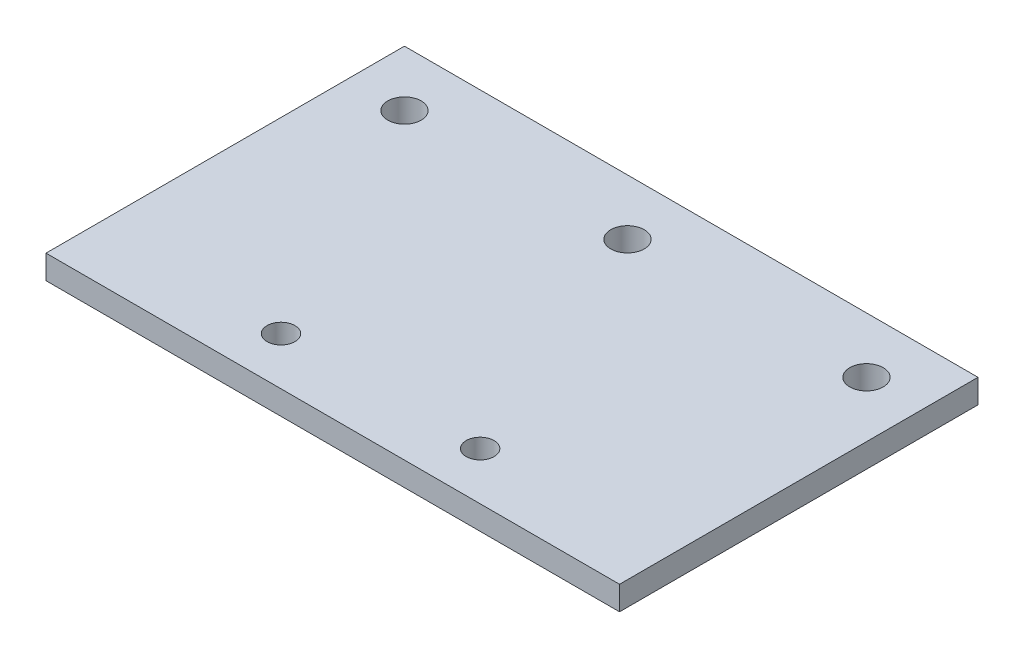
ISO-10303-21;
HEADER;
FILE_DESCRIPTION(('STEP AP214'),'2;1');
FILE_NAME('part.step','',(''),(''),'','','');
FILE_SCHEMA(('AUTOMOTIVE_DESIGN { 1 0 10303 214 1 1 1 1 }'));
ENDSEC;
DATA;
#1=APPLICATION_CONTEXT('core data for automotive mechanical design processes');
#2=APPLICATION_PROTOCOL_DEFINITION('international standard','automotive_design',2000,#1);
#3=PRODUCT_CONTEXT('',#1,'mechanical');
#4=PRODUCT('Part','Part','',(#3));
#5=PRODUCT_RELATED_PRODUCT_CATEGORY('part','',(#4));
#6=PRODUCT_DEFINITION_FORMATION('','',#4);
#7=PRODUCT_DEFINITION_CONTEXT('part definition',#1,'design');
#8=PRODUCT_DEFINITION('design','',#6,#7);
#9=PRODUCT_DEFINITION_SHAPE('','',#8);
#10=(LENGTH_UNIT() NAMED_UNIT(*) SI_UNIT(.MILLI.,.METRE.));
#11=(NAMED_UNIT(*) PLANE_ANGLE_UNIT() SI_UNIT($,.RADIAN.));
#12=(NAMED_UNIT(*) SI_UNIT($,.STERADIAN.) SOLID_ANGLE_UNIT());
#13=UNCERTAINTY_MEASURE_WITH_UNIT(LENGTH_MEASURE(1.E-05),#10,'distance_accuracy_value','');
#14=(GEOMETRIC_REPRESENTATION_CONTEXT(3) GLOBAL_UNCERTAINTY_ASSIGNED_CONTEXT((#13)) GLOBAL_UNIT_ASSIGNED_CONTEXT((#10,
#11,#12)) REPRESENTATION_CONTEXT('',''));
#15=CARTESIAN_POINT('',(0.,0.,0.));
#16=DIRECTION('',(0.,0.,1.));
#17=DIRECTION('',(1.,0.,0.));
#18=AXIS2_PLACEMENT_3D('',#15,#16,#17);
#19=CARTESIAN_POINT('',(0.,3.,0.));
#20=DIRECTION('',(0.,-1.,0.));
#21=DIRECTION('',(0.,0.,-1.));
#22=AXIS2_PLACEMENT_3D('',#19,#20,#21);
#23=PLANE('',#22);
#24=DIRECTION('',(0.,0.,1.));
#25=VECTOR('',#24,1.);
#26=CARTESIAN_POINT('',(0.,3.,45.));
#27=LINE('',#26,#25);
#28=CARTESIAN_POINT('',(0.,3.,0.));
#29=VERTEX_POINT('',#28);
#30=CARTESIAN_POINT('',(0.,3.,45.));
#31=VERTEX_POINT('',#30);
#32=EDGE_CURVE('E85',#29,#31,#27,.T.);
#33=ORIENTED_EDGE('',*,*,#32,.T.);
#34=DIRECTION('',(1.,0.,0.));
#35=VECTOR('',#34,1.);
#36=CARTESIAN_POINT('',(72.,3.,45.));
#37=LINE('',#36,#35);
#38=CARTESIAN_POINT('',(72.,3.,45.));
#39=VERTEX_POINT('',#38);
#40=EDGE_CURVE('E80',#31,#39,#37,.T.);
#41=ORIENTED_EDGE('',*,*,#40,.T.);
#42=DIRECTION('',(0.,0.,-1.));
#43=VECTOR('',#42,1.);
#44=CARTESIAN_POINT('',(72.,3.,0.));
#45=LINE('',#44,#43);
#46=CARTESIAN_POINT('',(72.,3.,0.));
#47=VERTEX_POINT('',#46);
#48=EDGE_CURVE('E83',#39,#47,#45,.T.);
#49=ORIENTED_EDGE('',*,*,#48,.T.);
#50=DIRECTION('',(-1.,0.,0.));
#51=VECTOR('',#50,1.);
#52=CARTESIAN_POINT('',(0.,3.,0.));
#53=LINE('',#52,#51);
#54=EDGE_CURVE('E50',#47,#29,#53,.T.);
#55=ORIENTED_EDGE('',*,*,#54,.T.);
#56=EDGE_LOOP('',(#33,#41,#49,#55));
#57=FACE_BOUND('',#56,.T.);
#58=CARTESIAN_POINT('',(7.,3.,7.));
#59=DIRECTION('',(0.,1.,0.));
#60=DIRECTION('',(0.,0.,1.));
#61=AXIS2_PLACEMENT_3D('',#58,#59,#60);
#62=CIRCLE('',#61,2.1);
#63=CARTESIAN_POINT('',(7.,3.,9.1));
#64=VERTEX_POINT('',#63);
#65=EDGE_CURVE('E100',#64,#64,#62,.T.);
#66=ORIENTED_EDGE('',*,*,#65,.F.);
#67=EDGE_LOOP('',(#66));
#68=FACE_BOUND('',#67,.T.);
#69=CARTESIAN_POINT('',(35.,3.,7.));
#70=DIRECTION('',(0.,1.,0.));
#71=DIRECTION('',(0.,0.,1.));
#72=AXIS2_PLACEMENT_3D('',#69,#70,#71);
#73=CIRCLE('',#72,2.1);
#74=CARTESIAN_POINT('',(35.,3.,9.1));
#75=VERTEX_POINT('',#74);
#76=EDGE_CURVE('E115',#75,#75,#73,.T.);
#77=ORIENTED_EDGE('',*,*,#76,.F.);
#78=EDGE_LOOP('',(#77));
#79=FACE_BOUND('',#78,.T.);
#80=CARTESIAN_POINT('',(65.,3.,7.));
#81=DIRECTION('',(0.,1.,0.));
#82=DIRECTION('',(0.,0.,1.));
#83=AXIS2_PLACEMENT_3D('',#80,#81,#82);
#84=CIRCLE('',#83,2.1);
#85=CARTESIAN_POINT('',(65.,3.,9.1));
#86=VERTEX_POINT('',#85);
#87=EDGE_CURVE('E121',#86,#86,#84,.T.);
#88=ORIENTED_EDGE('',*,*,#87,.F.);
#89=EDGE_LOOP('',(#88));
#90=FACE_BOUND('',#89,.T.);
#91=CARTESIAN_POINT('',(23.5,3.,39.));
#92=DIRECTION('',(0.,1.,0.));
#93=DIRECTION('',(0.,0.,1.));
#94=AXIS2_PLACEMENT_3D('',#91,#92,#93);
#95=CIRCLE('',#94,1.75);
#96=CARTESIAN_POINT('',(23.5,3.,40.75));
#97=VERTEX_POINT('',#96);
#98=EDGE_CURVE('E127',#97,#97,#95,.T.);
#99=ORIENTED_EDGE('',*,*,#98,.F.);
#100=EDGE_LOOP('',(#99));
#101=FACE_BOUND('',#100,.T.);
#102=CARTESIAN_POINT('',(48.5,3.,39.));
#103=DIRECTION('',(0.,1.,0.));
#104=DIRECTION('',(0.,0.,1.));
#105=AXIS2_PLACEMENT_3D('',#102,#103,#104);
#106=CIRCLE('',#105,1.75);
#107=CARTESIAN_POINT('',(48.5,3.,40.75));
#108=VERTEX_POINT('',#107);
#109=EDGE_CURVE('E133',#108,#108,#106,.T.);
#110=ORIENTED_EDGE('',*,*,#109,.F.);
#111=EDGE_LOOP('',(#110));
#112=FACE_BOUND('',#111,.T.);
#113=ADVANCED_FACE('F33',(#57,#68,#79,#90,#101,#112),#23,.F.);
#114=CARTESIAN_POINT('',(0.,0.,0.));
#115=DIRECTION('',(0.,-1.,0.));
#116=DIRECTION('',(0.,0.,-1.));
#117=AXIS2_PLACEMENT_3D('',#114,#115,#116);
#118=PLANE('',#117);
#119=CARTESIAN_POINT('',(23.5,0.,39.));
#120=DIRECTION('',(0.,1.,0.));
#121=DIRECTION('',(0.,0.,1.));
#122=AXIS2_PLACEMENT_3D('',#119,#120,#121);
#123=CIRCLE('',#122,1.75);
#124=CARTESIAN_POINT('',(23.5,0.,40.75));
#125=VERTEX_POINT('',#124);
#126=EDGE_CURVE('E130',#125,#125,#123,.T.);
#127=ORIENTED_EDGE('',*,*,#126,.T.);
#128=EDGE_LOOP('',(#127));
#129=FACE_BOUND('',#128,.T.);
#130=CARTESIAN_POINT('',(35.,0.,7.));
#131=DIRECTION('',(0.,1.,0.));
#132=DIRECTION('',(0.,0.,1.));
#133=AXIS2_PLACEMENT_3D('',#130,#131,#132);
#134=CIRCLE('',#133,2.1);
#135=CARTESIAN_POINT('',(35.,0.,9.1));
#136=VERTEX_POINT('',#135);
#137=EDGE_CURVE('E118',#136,#136,#134,.T.);
#138=ORIENTED_EDGE('',*,*,#137,.T.);
#139=EDGE_LOOP('',(#138));
#140=FACE_BOUND('',#139,.T.);
#141=DIRECTION('',(0.,0.,1.));
#142=VECTOR('',#141,1.);
#143=CARTESIAN_POINT('',(0.,0.,45.));
#144=LINE('',#143,#142);
#145=CARTESIAN_POINT('',(0.,0.,0.));
#146=VERTEX_POINT('',#145);
#147=CARTESIAN_POINT('',(0.,0.,45.));
#148=VERTEX_POINT('',#147);
#149=EDGE_CURVE('E97',#146,#148,#144,.T.);
#150=ORIENTED_EDGE('',*,*,#149,.F.);
#151=DIRECTION('',(-1.,0.,0.));
#152=VECTOR('',#151,1.);
#153=CARTESIAN_POINT('',(0.,0.,0.));
#154=LINE('',#153,#152);
#155=CARTESIAN_POINT('',(72.,0.,0.));
#156=VERTEX_POINT('',#155);
#157=EDGE_CURVE('E73',#156,#146,#154,.T.);
#158=ORIENTED_EDGE('',*,*,#157,.F.);
#159=DIRECTION('',(0.,0.,-1.));
#160=VECTOR('',#159,1.);
#161=CARTESIAN_POINT('',(72.,0.,0.));
#162=LINE('',#161,#160);
#163=CARTESIAN_POINT('',(72.,0.,45.));
#164=VERTEX_POINT('',#163);
#165=EDGE_CURVE('E67',#164,#156,#162,.T.);
#166=ORIENTED_EDGE('',*,*,#165,.F.);
#167=DIRECTION('',(1.,0.,0.));
#168=VECTOR('',#167,1.);
#169=CARTESIAN_POINT('',(72.,0.,45.));
#170=LINE('',#169,#168);
#171=EDGE_CURVE('E89',#148,#164,#170,.T.);
#172=ORIENTED_EDGE('',*,*,#171,.F.);
#173=EDGE_LOOP('',(#150,#158,#166,#172));
#174=FACE_BOUND('',#173,.T.);
#175=CARTESIAN_POINT('',(7.,0.,7.));
#176=DIRECTION('',(0.,1.,0.));
#177=DIRECTION('',(0.,0.,1.));
#178=AXIS2_PLACEMENT_3D('',#175,#176,#177);
#179=CIRCLE('',#178,2.1);
#180=CARTESIAN_POINT('',(7.,0.,9.1));
#181=VERTEX_POINT('',#180);
#182=EDGE_CURVE('E112',#181,#181,#179,.T.);
#183=ORIENTED_EDGE('',*,*,#182,.T.);
#184=EDGE_LOOP('',(#183));
#185=FACE_BOUND('',#184,.T.);
#186=CARTESIAN_POINT('',(65.,0.,7.));
#187=DIRECTION('',(0.,1.,0.));
#188=DIRECTION('',(0.,0.,1.));
#189=AXIS2_PLACEMENT_3D('',#186,#187,#188);
#190=CIRCLE('',#189,2.1);
#191=CARTESIAN_POINT('',(65.,0.,9.1));
#192=VERTEX_POINT('',#191);
#193=EDGE_CURVE('E124',#192,#192,#190,.T.);
#194=ORIENTED_EDGE('',*,*,#193,.T.);
#195=EDGE_LOOP('',(#194));
#196=FACE_BOUND('',#195,.T.);
#197=CARTESIAN_POINT('',(48.5,0.,39.));
#198=DIRECTION('',(0.,1.,0.));
#199=DIRECTION('',(0.,0.,1.));
#200=AXIS2_PLACEMENT_3D('',#197,#198,#199);
#201=CIRCLE('',#200,1.75);
#202=CARTESIAN_POINT('',(48.5,0.,40.75));
#203=VERTEX_POINT('',#202);
#204=EDGE_CURVE('E136',#203,#203,#201,.T.);
#205=ORIENTED_EDGE('',*,*,#204,.T.);
#206=EDGE_LOOP('',(#205));
#207=FACE_BOUND('',#206,.T.);
#208=ADVANCED_FACE('F108',(#129,#140,#174,#185,#196,#207),#118,.T.);
#209=CARTESIAN_POINT('',(0.,3.,45.));
#210=DIRECTION('',(1.,0.,0.));
#211=DIRECTION('',(0.,0.,-1.));
#212=AXIS2_PLACEMENT_3D('',#209,#210,#211);
#213=PLANE('',#212);
#214=ORIENTED_EDGE('',*,*,#149,.T.);
#215=DIRECTION('',(0.,-1.,0.));
#216=VECTOR('',#215,1.);
#217=CARTESIAN_POINT('',(0.,3.,45.));
#218=LINE('',#217,#216);
#219=EDGE_CURVE('E11',#31,#148,#218,.T.);
#220=ORIENTED_EDGE('',*,*,#219,.F.);
#221=ORIENTED_EDGE('',*,*,#32,.F.);
#222=DIRECTION('',(0.,-1.,0.));
#223=VECTOR('',#222,1.);
#224=CARTESIAN_POINT('',(0.,3.,0.));
#225=LINE('',#224,#223);
#226=EDGE_CURVE('E93',#29,#146,#225,.T.);
#227=ORIENTED_EDGE('',*,*,#226,.T.);
#228=EDGE_LOOP('',(#214,#220,#221,#227));
#229=FACE_BOUND('',#228,.T.);
#230=ADVANCED_FACE('F35',(#229),#213,.F.);
#231=CARTESIAN_POINT('',(72.,3.,45.));
#232=DIRECTION('',(0.,0.,-1.));
#233=DIRECTION('',(-1.,0.,0.));
#234=AXIS2_PLACEMENT_3D('',#231,#232,#233);
#235=PLANE('',#234);
#236=ORIENTED_EDGE('',*,*,#171,.T.);
#237=DIRECTION('',(0.,-1.,0.));
#238=VECTOR('',#237,1.);
#239=CARTESIAN_POINT('',(72.,3.,45.));
#240=LINE('',#239,#238);
#241=EDGE_CURVE('E42',#39,#164,#240,.T.);
#242=ORIENTED_EDGE('',*,*,#241,.F.);
#243=ORIENTED_EDGE('',*,*,#40,.F.);
#244=ORIENTED_EDGE('',*,*,#219,.T.);
#245=EDGE_LOOP('',(#236,#242,#243,#244));
#246=FACE_BOUND('',#245,.T.);
#247=ADVANCED_FACE('F88',(#246),#235,.F.);
#248=CARTESIAN_POINT('',(72.,3.,0.));
#249=DIRECTION('',(-1.,0.,0.));
#250=DIRECTION('',(0.,0.,1.));
#251=AXIS2_PLACEMENT_3D('',#248,#249,#250);
#252=PLANE('',#251);
#253=ORIENTED_EDGE('',*,*,#165,.T.);
#254=DIRECTION('',(0.,-1.,0.));
#255=VECTOR('',#254,1.);
#256=CARTESIAN_POINT('',(72.,3.,0.));
#257=LINE('',#256,#255);
#258=EDGE_CURVE('E90',#47,#156,#257,.T.);
#259=ORIENTED_EDGE('',*,*,#258,.F.);
#260=ORIENTED_EDGE('',*,*,#48,.F.);
#261=ORIENTED_EDGE('',*,*,#241,.T.);
#262=EDGE_LOOP('',(#253,#259,#260,#261));
#263=FACE_BOUND('',#262,.T.);
#264=ADVANCED_FACE('F91',(#263),#252,.F.);
#265=CARTESIAN_POINT('',(0.,3.,0.));
#266=DIRECTION('',(0.,0.,1.));
#267=DIRECTION('',(1.,0.,0.));
#268=AXIS2_PLACEMENT_3D('',#265,#266,#267);
#269=PLANE('',#268);
#270=ORIENTED_EDGE('',*,*,#157,.T.);
#271=ORIENTED_EDGE('',*,*,#226,.F.);
#272=ORIENTED_EDGE('',*,*,#54,.F.);
#273=ORIENTED_EDGE('',*,*,#258,.T.);
#274=EDGE_LOOP('',(#270,#271,#272,#273));
#275=FACE_BOUND('',#274,.T.);
#276=ADVANCED_FACE('F105',(#275),#269,.F.);
#277=CARTESIAN_POINT('',(7.,3.,7.));
#278=DIRECTION('',(0.,-1.,0.));
#279=DIRECTION('',(0.,0.,-1.));
#280=AXIS2_PLACEMENT_3D('',#277,#278,#279);
#281=CYLINDRICAL_SURFACE('',#280,2.1);
#282=ORIENTED_EDGE('',*,*,#65,.T.);
#283=EDGE_LOOP('',(#282));
#284=FACE_BOUND('',#283,.T.);
#285=ORIENTED_EDGE('',*,*,#182,.F.);
#286=EDGE_LOOP('',(#285));
#287=FACE_BOUND('',#286,.T.);
#288=ADVANCED_FACE('F153',(#284,#287),#281,.F.);
#289=CARTESIAN_POINT('',(35.,3.,7.));
#290=DIRECTION('',(0.,-1.,0.));
#291=DIRECTION('',(0.,0.,-1.));
#292=AXIS2_PLACEMENT_3D('',#289,#290,#291);
#293=CYLINDRICAL_SURFACE('',#292,2.1);
#294=ORIENTED_EDGE('',*,*,#76,.T.);
#295=EDGE_LOOP('',(#294));
#296=FACE_BOUND('',#295,.T.);
#297=ORIENTED_EDGE('',*,*,#137,.F.);
#298=EDGE_LOOP('',(#297));
#299=FACE_BOUND('',#298,.T.);
#300=ADVANCED_FACE('F199',(#296,#299),#293,.F.);
#301=CARTESIAN_POINT('',(65.,3.,7.));
#302=DIRECTION('',(0.,-1.,0.));
#303=DIRECTION('',(0.,0.,-1.));
#304=AXIS2_PLACEMENT_3D('',#301,#302,#303);
#305=CYLINDRICAL_SURFACE('',#304,2.1);
#306=ORIENTED_EDGE('',*,*,#87,.T.);
#307=EDGE_LOOP('',(#306));
#308=FACE_BOUND('',#307,.T.);
#309=ORIENTED_EDGE('',*,*,#193,.F.);
#310=EDGE_LOOP('',(#309));
#311=FACE_BOUND('',#310,.T.);
#312=ADVANCED_FACE('F207',(#308,#311),#305,.F.);
#313=CARTESIAN_POINT('',(23.5,3.,39.));
#314=DIRECTION('',(0.,-1.,0.));
#315=DIRECTION('',(0.,0.,-1.));
#316=AXIS2_PLACEMENT_3D('',#313,#314,#315);
#317=CYLINDRICAL_SURFACE('',#316,1.75);
#318=ORIENTED_EDGE('',*,*,#98,.T.);
#319=EDGE_LOOP('',(#318));
#320=FACE_BOUND('',#319,.T.);
#321=ORIENTED_EDGE('',*,*,#126,.F.);
#322=EDGE_LOOP('',(#321));
#323=FACE_BOUND('',#322,.T.);
#324=ADVANCED_FACE('F215',(#320,#323),#317,.F.);
#325=CARTESIAN_POINT('',(48.5,3.,39.));
#326=DIRECTION('',(0.,-1.,0.));
#327=DIRECTION('',(0.,0.,-1.));
#328=AXIS2_PLACEMENT_3D('',#325,#326,#327);
#329=CYLINDRICAL_SURFACE('',#328,1.75);
#330=ORIENTED_EDGE('',*,*,#109,.T.);
#331=EDGE_LOOP('',(#330));
#332=FACE_BOUND('',#331,.T.);
#333=ORIENTED_EDGE('',*,*,#204,.F.);
#334=EDGE_LOOP('',(#333));
#335=FACE_BOUND('',#334,.T.);
#336=ADVANCED_FACE('F142',(#332,#335),#329,.F.);
#337=CLOSED_SHELL('',(#113,#208,#230,#247,#264,#276,#288,#300,#312,#324,#336));
#338=MANIFOLD_SOLID_BREP('B2',#337);
#339=ADVANCED_BREP_SHAPE_REPRESENTATION('',(#18,#338),#14);
#340=SHAPE_DEFINITION_REPRESENTATION(#9,#339);
ENDSEC;
END-ISO-10303-21;
